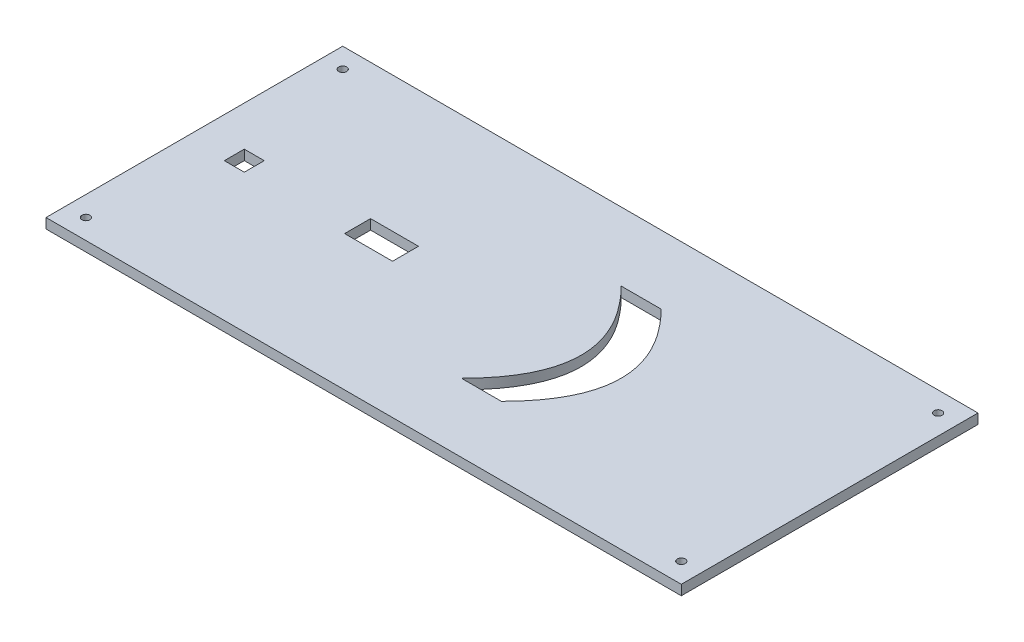
ISO-10303-21;
HEADER;
FILE_DESCRIPTION(('STEP AP214'),'2;1');
FILE_NAME('part.step','',(''),(''),'','','');
FILE_SCHEMA(('AUTOMOTIVE_DESIGN { 1 0 10303 214 1 1 1 1 }'));
ENDSEC;
DATA;
#1=APPLICATION_CONTEXT('core data for automotive mechanical design processes');
#2=APPLICATION_PROTOCOL_DEFINITION('international standard','automotive_design',2000,#1);
#3=PRODUCT_CONTEXT('',#1,'mechanical');
#4=PRODUCT('Part','Part','',(#3));
#5=PRODUCT_RELATED_PRODUCT_CATEGORY('part','',(#4));
#6=PRODUCT_DEFINITION_FORMATION('','',#4);
#7=PRODUCT_DEFINITION_CONTEXT('part definition',#1,'design');
#8=PRODUCT_DEFINITION('design','',#6,#7);
#9=PRODUCT_DEFINITION_SHAPE('','',#8);
#10=(LENGTH_UNIT() NAMED_UNIT(*) SI_UNIT(.MILLI.,.METRE.));
#11=(NAMED_UNIT(*) PLANE_ANGLE_UNIT() SI_UNIT($,.RADIAN.));
#12=(NAMED_UNIT(*) SI_UNIT($,.STERADIAN.) SOLID_ANGLE_UNIT());
#13=UNCERTAINTY_MEASURE_WITH_UNIT(LENGTH_MEASURE(1.E-05),#10,'distance_accuracy_value','');
#14=(GEOMETRIC_REPRESENTATION_CONTEXT(3) GLOBAL_UNCERTAINTY_ASSIGNED_CONTEXT((#13)) GLOBAL_UNIT_ASSIGNED_CONTEXT((#10,
#11,#12)) REPRESENTATION_CONTEXT('',''));
#15=CARTESIAN_POINT('',(0.,0.,0.));
#16=DIRECTION('',(0.,0.,1.));
#17=DIRECTION('',(1.,0.,0.));
#18=AXIS2_PLACEMENT_3D('',#15,#16,#17);
#19=CARTESIAN_POINT('',(0.,5.,0.));
#20=DIRECTION('',(0.,1.,0.));
#21=DIRECTION('',(0.,0.,1.));
#22=AXIS2_PLACEMENT_3D('',#19,#20,#21);
#23=PLANE('',#22);
#24=DIRECTION('',(1.,0.,0.));
#25=VECTOR('',#24,1.);
#26=CARTESIAN_POINT('',(0.,5.,83.6828178047649));
#27=LINE('',#26,#25);
#28=CARTESIAN_POINT('',(49.9824819781354,5.,83.6828178047649));
#29=VERTEX_POINT('',#28);
#30=CARTESIAN_POINT('',(73.9824819781354,5.,83.6828178047649));
#31=VERTEX_POINT('',#30);
#32=EDGE_CURVE('E336',#29,#31,#27,.T.);
#33=ORIENTED_EDGE('',*,*,#32,.F.);
#34=DIRECTION('',(0.,0.,1.));
#35=VECTOR('',#34,1.);
#36=CARTESIAN_POINT('',(49.9824819781354,5.,0.));
#37=LINE('',#36,#35);
#38=CARTESIAN_POINT('',(49.9824819781354,5.,70.6828178047649));
#39=VERTEX_POINT('',#38);
#40=EDGE_CURVE('E326',#39,#29,#37,.T.);
#41=ORIENTED_EDGE('',*,*,#40,.F.);
#42=DIRECTION('',(-1.,0.,0.));
#43=VECTOR('',#42,1.);
#44=CARTESIAN_POINT('',(0.,5.,70.6828178047649));
#45=LINE('',#44,#43);
#46=CARTESIAN_POINT('',(73.9824819781354,5.,70.6828178047649));
#47=VERTEX_POINT('',#46);
#48=EDGE_CURVE('E330',#47,#39,#45,.T.);
#49=ORIENTED_EDGE('',*,*,#48,.F.);
#50=DIRECTION('',(0.,0.,-1.));
#51=VECTOR('',#50,1.);
#52=CARTESIAN_POINT('',(73.9824819781354,5.,0.));
#53=LINE('',#52,#51);
#54=EDGE_CURVE('E333',#31,#47,#53,.T.);
#55=ORIENTED_EDGE('',*,*,#54,.F.);
#56=EDGE_LOOP('',(#33,#41,#49,#55));
#57=FACE_BOUND('',#56,.T.);
#58=CARTESIAN_POINT('',(276.384454851621,5.,141.477817804765));
#59=DIRECTION('',(0.,1.,0.));
#60=DIRECTION('',(0.,0.,1.));
#61=AXIS2_PLACEMENT_3D('',#58,#59,#60);
#62=CIRCLE('',#61,2.);
#63=CARTESIAN_POINT('',(276.384454851621,5.,143.477817804765));
#64=VERTEX_POINT('',#63);
#65=EDGE_CURVE('E299',#64,#64,#62,.T.);
#66=ORIENTED_EDGE('',*,*,#65,.F.);
#67=EDGE_LOOP('',(#66));
#68=FACE_BOUND('',#67,.T.);
#69=CARTESIAN_POINT('',(276.384454851621,5.,12.8878178047649));
#70=DIRECTION('',(0.,1.,0.));
#71=DIRECTION('',(0.,0.,1.));
#72=AXIS2_PLACEMENT_3D('',#69,#70,#71);
#73=CIRCLE('',#72,2.);
#74=CARTESIAN_POINT('',(276.384454851621,5.,14.8878178047649));
#75=VERTEX_POINT('',#74);
#76=EDGE_CURVE('E306',#75,#75,#73,.T.);
#77=ORIENTED_EDGE('',*,*,#76,.F.);
#78=EDGE_LOOP('',(#77));
#79=FACE_BOUND('',#78,.T.);
#80=CARTESIAN_POINT('',(-21.7655451483791,5.,12.8878178047649));
#81=DIRECTION('',(0.,1.,0.));
#82=DIRECTION('',(0.,0.,1.));
#83=AXIS2_PLACEMENT_3D('',#80,#81,#82);
#84=CIRCLE('',#83,2.);
#85=CARTESIAN_POINT('',(-21.7655451483791,5.,14.8878178047649));
#86=VERTEX_POINT('',#85);
#87=EDGE_CURVE('E312',#86,#86,#84,.T.);
#88=ORIENTED_EDGE('',*,*,#87,.F.);
#89=EDGE_LOOP('',(#88));
#90=FACE_BOUND('',#89,.T.);
#91=CARTESIAN_POINT('',(-21.7655451483791,5.,141.477817804765));
#92=DIRECTION('',(0.,1.,0.));
#93=DIRECTION('',(0.,0.,1.));
#94=AXIS2_PLACEMENT_3D('',#91,#92,#93);
#95=CIRCLE('',#94,2.);
#96=CARTESIAN_POINT('',(-21.7655451483791,5.,143.477817804765));
#97=VERTEX_POINT('',#96);
#98=EDGE_CURVE('E293',#97,#97,#95,.T.);
#99=ORIENTED_EDGE('',*,*,#98,.F.);
#100=EDGE_LOOP('',(#99));
#101=FACE_BOUND('',#100,.T.);
#102=DIRECTION('',(0.,0.,1.));
#103=VECTOR('',#102,1.);
#104=CARTESIAN_POINT('',(286.384454851621,5.,1.06989237388449E-13));
#105=LINE('',#104,#103);
#106=CARTESIAN_POINT('',(286.384454851621,5.,2.88781780476488));
#107=VERTEX_POINT('',#106);
#108=CARTESIAN_POINT('',(286.384454851621,5.,151.477817804765));
#109=VERTEX_POINT('',#108);
#110=EDGE_CURVE('E272',#107,#109,#105,.T.);
#111=ORIENTED_EDGE('',*,*,#110,.F.);
#112=DIRECTION('',(1.,0.,0.));
#113=VECTOR('',#112,1.);
#114=CARTESIAN_POINT('',(0.,5.,2.88781780476488));
#115=LINE('',#114,#113);
#116=CARTESIAN_POINT('',(-31.7655451483791,5.,2.88781780476488));
#117=VERTEX_POINT('',#116);
#118=EDGE_CURVE('E288',#117,#107,#115,.T.);
#119=ORIENTED_EDGE('',*,*,#118,.F.);
#120=DIRECTION('',(0.,0.,1.));
#121=VECTOR('',#120,1.);
#122=CARTESIAN_POINT('',(-31.7655451483791,5.,0.));
#123=LINE('',#122,#121);
#124=CARTESIAN_POINT('',(-31.7655451483791,5.,151.477817804765));
#125=VERTEX_POINT('',#124);
#126=EDGE_CURVE('E279',#117,#125,#123,.T.);
#127=ORIENTED_EDGE('',*,*,#126,.T.);
#128=DIRECTION('',(1.,0.,0.));
#129=VECTOR('',#128,1.);
#130=CARTESIAN_POINT('',(0.,5.,151.477817804765));
#131=LINE('',#130,#129);
#132=EDGE_CURVE('E276',#125,#109,#131,.T.);
#133=ORIENTED_EDGE('',*,*,#132,.T.);
#134=EDGE_LOOP('',(#111,#119,#127,#133));
#135=FACE_BOUND('',#134,.T.);
#136=DIRECTION('',(-1.,0.,0.));
#137=VECTOR('',#136,1.);
#138=CARTESIAN_POINT('',(161.982481978135,5.,37.1828178047649));
#139=LINE('',#138,#137);
#140=CARTESIAN_POINT('',(161.982481978135,5.,37.1828178047649));
#141=VERTEX_POINT('',#140);
#142=CARTESIAN_POINT('',(141.982481978135,5.,37.1828178047649));
#143=VERTEX_POINT('',#142);
#144=EDGE_CURVE('E185',#141,#143,#139,.T.);
#145=ORIENTED_EDGE('',*,*,#144,.F.);
#146=CARTESIAN_POINT('',(161.982481978135,5.,117.182817804765));
#147=CARTESIAN_POINT('',(201.982481978135,5.,77.1828178047649));
#148=CARTESIAN_POINT('',(161.982481978135,5.,37.1828178047649));
#149=B_SPLINE_CURVE_WITH_KNOTS('',2,(#146,#147,#148),.UNSPECIFIED.,.F.,.F.,(3,3),(0.,1.),.UNSPECIFIED.);
#150=CARTESIAN_POINT('',(161.982481978135,5.,117.182817804765));
#151=VERTEX_POINT('',#150);
#152=EDGE_CURVE('E180',#151,#141,#149,.T.);
#153=ORIENTED_EDGE('',*,*,#152,.F.);
#154=DIRECTION('',(-1.,0.,0.));
#155=VECTOR('',#154,1.);
#156=CARTESIAN_POINT('',(161.982481978135,5.,117.182817804765));
#157=LINE('',#156,#155);
#158=CARTESIAN_POINT('',(141.982481978135,5.,117.182817804765));
#159=VERTEX_POINT('',#158);
#160=EDGE_CURVE('E358',#151,#159,#157,.T.);
#161=ORIENTED_EDGE('',*,*,#160,.T.);
#162=CARTESIAN_POINT('',(141.982481978135,5.,117.182817804765));
#163=CARTESIAN_POINT('',(181.982481978135,5.,77.1828178047649));
#164=CARTESIAN_POINT('',(141.982481978135,5.,37.1828178047649));
#165=B_SPLINE_CURVE_WITH_KNOTS('',2,(#162,#163,#164),.UNSPECIFIED.,.F.,.F.,(3,3),(0.,1.),.UNSPECIFIED.);
#166=EDGE_CURVE('E380',#159,#143,#165,.T.);
#167=ORIENTED_EDGE('',*,*,#166,.T.);
#168=EDGE_LOOP('',(#145,#153,#161,#167));
#169=FACE_BOUND('',#168,.T.);
#170=DIRECTION('',(0.,0.,1.));
#171=VECTOR('',#170,1.);
#172=CARTESIAN_POINT('',(-11.7655451483791,5.,0.));
#173=LINE('',#172,#171);
#174=CARTESIAN_POINT('',(-11.7655451483791,5.,72.1828178047649));
#175=VERTEX_POINT('',#174);
#176=CARTESIAN_POINT('',(-11.7655451483791,5.,82.1828178047649));
#177=VERTEX_POINT('',#176);
#178=EDGE_CURVE('E151',#175,#177,#173,.T.);
#179=ORIENTED_EDGE('',*,*,#178,.F.);
#180=DIRECTION('',(-1.,0.,0.));
#181=VECTOR('',#180,1.);
#182=CARTESIAN_POINT('',(0.,5.,72.1828178047649));
#183=LINE('',#182,#181);
#184=CARTESIAN_POINT('',(-1.76554514837909,5.,72.1828178047649));
#185=VERTEX_POINT('',#184);
#186=EDGE_CURVE('E148',#185,#175,#183,.T.);
#187=ORIENTED_EDGE('',*,*,#186,.F.);
#188=DIRECTION('',(0.,0.,1.));
#189=VECTOR('',#188,1.);
#190=CARTESIAN_POINT('',(-1.76554514837909,5.,0.));
#191=LINE('',#190,#189);
#192=CARTESIAN_POINT('',(-1.76554514837909,5.,82.1828178047649));
#193=VERTEX_POINT('',#192);
#194=EDGE_CURVE('E154',#185,#193,#191,.T.);
#195=ORIENTED_EDGE('',*,*,#194,.T.);
#196=DIRECTION('',(1.,0.,0.));
#197=VECTOR('',#196,1.);
#198=CARTESIAN_POINT('',(0.,5.,82.1828178047649));
#199=LINE('',#198,#197);
#200=EDGE_CURVE('E158',#177,#193,#199,.T.);
#201=ORIENTED_EDGE('',*,*,#200,.F.);
#202=EDGE_LOOP('',(#179,#187,#195,#201));
#203=FACE_BOUND('',#202,.T.);
#204=ADVANCED_FACE('F34',(#57,#68,#79,#90,#101,#135,#169,#203),#23,.T.);
#205=CARTESIAN_POINT('',(0.,0.,0.));
#206=DIRECTION('',(0.,1.,0.));
#207=DIRECTION('',(0.,0.,1.));
#208=AXIS2_PLACEMENT_3D('',#205,#206,#207);
#209=PLANE('',#208);
#210=CARTESIAN_POINT('',(161.982481978135,0.,117.182817804765));
#211=CARTESIAN_POINT('',(201.982481978135,0.,77.1828178047649));
#212=CARTESIAN_POINT('',(161.982481978135,0.,37.1828178047649));
#213=B_SPLINE_CURVE_WITH_KNOTS('',2,(#210,#211,#212),.UNSPECIFIED.,.F.,.F.,(3,3),(0.,1.),.UNSPECIFIED.);
#214=CARTESIAN_POINT('',(161.982481978135,0.,117.182817804765));
#215=VERTEX_POINT('',#214);
#216=CARTESIAN_POINT('',(161.982481978135,0.,37.1828178047649));
#217=VERTEX_POINT('',#216);
#218=EDGE_CURVE('E176',#215,#217,#213,.T.);
#219=ORIENTED_EDGE('',*,*,#218,.T.);
#220=DIRECTION('',(-1.,0.,0.));
#221=VECTOR('',#220,1.);
#222=CARTESIAN_POINT('',(161.982481978135,0.,37.1828178047649));
#223=LINE('',#222,#221);
#224=CARTESIAN_POINT('',(141.982481978135,0.,37.1828178047649));
#225=VERTEX_POINT('',#224);
#226=EDGE_CURVE('E366',#217,#225,#223,.T.);
#227=ORIENTED_EDGE('',*,*,#226,.T.);
#228=CARTESIAN_POINT('',(141.982481978135,0.,117.182817804765));
#229=CARTESIAN_POINT('',(181.982481978135,0.,77.1828178047649));
#230=CARTESIAN_POINT('',(141.982481978135,0.,37.1828178047649));
#231=B_SPLINE_CURVE_WITH_KNOTS('',2,(#228,#229,#230),.UNSPECIFIED.,.F.,.F.,(3,3),(0.,1.),.UNSPECIFIED.);
#232=CARTESIAN_POINT('',(141.982481978135,0.,117.182817804765));
#233=VERTEX_POINT('',#232);
#234=EDGE_CURVE('E361',#233,#225,#231,.T.);
#235=ORIENTED_EDGE('',*,*,#234,.F.);
#236=DIRECTION('',(-1.,0.,0.));
#237=VECTOR('',#236,1.);
#238=CARTESIAN_POINT('',(161.982481978135,0.,117.182817804765));
#239=LINE('',#238,#237);
#240=EDGE_CURVE('E186',#215,#233,#239,.T.);
#241=ORIENTED_EDGE('',*,*,#240,.F.);
#242=EDGE_LOOP('',(#219,#227,#235,#241));
#243=FACE_BOUND('',#242,.T.);
#244=DIRECTION('',(0.,0.,1.));
#245=VECTOR('',#244,1.);
#246=CARTESIAN_POINT('',(49.9824819781354,0.,0.));
#247=LINE('',#246,#245);
#248=CARTESIAN_POINT('',(49.9824819781354,0.,70.6828178047649));
#249=VERTEX_POINT('',#248);
#250=CARTESIAN_POINT('',(49.9824819781354,0.,83.6828178047649));
#251=VERTEX_POINT('',#250);
#252=EDGE_CURVE('E321',#249,#251,#247,.T.);
#253=ORIENTED_EDGE('',*,*,#252,.T.);
#254=DIRECTION('',(1.,0.,0.));
#255=VECTOR('',#254,1.);
#256=CARTESIAN_POINT('',(0.,0.,83.6828178047649));
#257=LINE('',#256,#255);
#258=CARTESIAN_POINT('',(73.9824819781354,0.,83.6828178047649));
#259=VERTEX_POINT('',#258);
#260=EDGE_CURVE('E329',#251,#259,#257,.T.);
#261=ORIENTED_EDGE('',*,*,#260,.T.);
#262=DIRECTION('',(0.,0.,-1.));
#263=VECTOR('',#262,1.);
#264=CARTESIAN_POINT('',(73.9824819781354,0.,0.));
#265=LINE('',#264,#263);
#266=CARTESIAN_POINT('',(73.9824819781354,0.,70.6828178047649));
#267=VERTEX_POINT('',#266);
#268=EDGE_CURVE('E344',#259,#267,#265,.T.);
#269=ORIENTED_EDGE('',*,*,#268,.T.);
#270=DIRECTION('',(-1.,0.,0.));
#271=VECTOR('',#270,1.);
#272=CARTESIAN_POINT('',(0.,0.,70.6828178047649));
#273=LINE('',#272,#271);
#274=EDGE_CURVE('E341',#267,#249,#273,.T.);
#275=ORIENTED_EDGE('',*,*,#274,.T.);
#276=EDGE_LOOP('',(#253,#261,#269,#275));
#277=FACE_BOUND('',#276,.T.);
#278=CARTESIAN_POINT('',(276.384454851621,0.,141.477817804765));
#279=DIRECTION('',(0.,1.,0.));
#280=DIRECTION('',(0.,0.,1.));
#281=AXIS2_PLACEMENT_3D('',#278,#279,#280);
#282=CIRCLE('',#281,2.);
#283=CARTESIAN_POINT('',(276.384454851621,0.,143.477817804765));
#284=VERTEX_POINT('',#283);
#285=EDGE_CURVE('E302',#284,#284,#282,.T.);
#286=ORIENTED_EDGE('',*,*,#285,.T.);
#287=EDGE_LOOP('',(#286));
#288=FACE_BOUND('',#287,.T.);
#289=CARTESIAN_POINT('',(276.384454851621,0.,12.8878178047649));
#290=DIRECTION('',(0.,1.,0.));
#291=DIRECTION('',(0.,0.,1.));
#292=AXIS2_PLACEMENT_3D('',#289,#290,#291);
#293=CIRCLE('',#292,2.);
#294=CARTESIAN_POINT('',(276.384454851621,0.,14.8878178047649));
#295=VERTEX_POINT('',#294);
#296=EDGE_CURVE('E309',#295,#295,#293,.T.);
#297=ORIENTED_EDGE('',*,*,#296,.T.);
#298=EDGE_LOOP('',(#297));
#299=FACE_BOUND('',#298,.T.);
#300=CARTESIAN_POINT('',(-21.7655451483791,0.,12.8878178047649));
#301=DIRECTION('',(0.,1.,0.));
#302=DIRECTION('',(0.,0.,1.));
#303=AXIS2_PLACEMENT_3D('',#300,#301,#302);
#304=CIRCLE('',#303,2.);
#305=CARTESIAN_POINT('',(-21.7655451483791,0.,14.8878178047649));
#306=VERTEX_POINT('',#305);
#307=EDGE_CURVE('E296',#306,#306,#304,.T.);
#308=ORIENTED_EDGE('',*,*,#307,.T.);
#309=EDGE_LOOP('',(#308));
#310=FACE_BOUND('',#309,.T.);
#311=CARTESIAN_POINT('',(-21.7655451483791,0.,141.477817804765));
#312=DIRECTION('',(0.,1.,0.));
#313=DIRECTION('',(0.,0.,1.));
#314=AXIS2_PLACEMENT_3D('',#311,#312,#313);
#315=CIRCLE('',#314,2.);
#316=CARTESIAN_POINT('',(-21.7655451483791,0.,143.477817804765));
#317=VERTEX_POINT('',#316);
#318=EDGE_CURVE('E266',#317,#317,#315,.T.);
#319=ORIENTED_EDGE('',*,*,#318,.T.);
#320=EDGE_LOOP('',(#319));
#321=FACE_BOUND('',#320,.T.);
#322=DIRECTION('',(0.,0.,1.));
#323=VECTOR('',#322,1.);
#324=CARTESIAN_POINT('',(286.384454851621,0.,1.06989237388449E-13));
#325=LINE('',#324,#323);
#326=CARTESIAN_POINT('',(286.384454851621,0.,2.88781780476488));
#327=VERTEX_POINT('',#326);
#328=CARTESIAN_POINT('',(286.384454851621,0.,151.477817804765));
#329=VERTEX_POINT('',#328);
#330=EDGE_CURVE('E262',#327,#329,#325,.T.);
#331=ORIENTED_EDGE('',*,*,#330,.T.);
#332=DIRECTION('',(1.,0.,0.));
#333=VECTOR('',#332,1.);
#334=CARTESIAN_POINT('',(0.,0.,151.477817804765));
#335=LINE('',#334,#333);
#336=CARTESIAN_POINT('',(-31.7655451483791,0.,151.477817804765));
#337=VERTEX_POINT('',#336);
#338=EDGE_CURVE('E264',#337,#329,#335,.T.);
#339=ORIENTED_EDGE('',*,*,#338,.F.);
#340=DIRECTION('',(0.,0.,1.));
#341=VECTOR('',#340,1.);
#342=CARTESIAN_POINT('',(-31.7655451483791,0.,0.));
#343=LINE('',#342,#341);
#344=CARTESIAN_POINT('',(-31.7655451483791,0.,2.88781780476488));
#345=VERTEX_POINT('',#344);
#346=EDGE_CURVE('E261',#345,#337,#343,.T.);
#347=ORIENTED_EDGE('',*,*,#346,.F.);
#348=DIRECTION('',(1.,0.,0.));
#349=VECTOR('',#348,1.);
#350=CARTESIAN_POINT('',(0.,0.,2.88781780476488));
#351=LINE('',#350,#349);
#352=EDGE_CURVE('E254',#345,#327,#351,.T.);
#353=ORIENTED_EDGE('',*,*,#352,.T.);
#354=EDGE_LOOP('',(#331,#339,#347,#353));
#355=FACE_BOUND('',#354,.T.);
#356=DIRECTION('',(-1.,0.,0.));
#357=VECTOR('',#356,1.);
#358=CARTESIAN_POINT('',(0.,0.,72.1828178047649));
#359=LINE('',#358,#357);
#360=CARTESIAN_POINT('',(-1.76554514837909,0.,72.1828178047649));
#361=VERTEX_POINT('',#360);
#362=CARTESIAN_POINT('',(-11.7655451483791,0.,72.1828178047649));
#363=VERTEX_POINT('',#362);
#364=EDGE_CURVE('E57',#361,#363,#359,.T.);
#365=ORIENTED_EDGE('',*,*,#364,.T.);
#366=DIRECTION('',(0.,0.,1.));
#367=VECTOR('',#366,1.);
#368=CARTESIAN_POINT('',(-11.7655451483791,0.,0.));
#369=LINE('',#368,#367);
#370=CARTESIAN_POINT('',(-11.7655451483791,0.,82.1828178047649));
#371=VERTEX_POINT('',#370);
#372=EDGE_CURVE('E161',#363,#371,#369,.T.);
#373=ORIENTED_EDGE('',*,*,#372,.T.);
#374=DIRECTION('',(1.,0.,0.));
#375=VECTOR('',#374,1.);
#376=CARTESIAN_POINT('',(0.,0.,82.1828178047649));
#377=LINE('',#376,#375);
#378=CARTESIAN_POINT('',(-1.76554514837909,0.,82.1828178047649));
#379=VERTEX_POINT('',#378);
#380=EDGE_CURVE('E164',#371,#379,#377,.T.);
#381=ORIENTED_EDGE('',*,*,#380,.T.);
#382=DIRECTION('',(0.,0.,1.));
#383=VECTOR('',#382,1.);
#384=CARTESIAN_POINT('',(-1.76554514837909,0.,0.));
#385=LINE('',#384,#383);
#386=EDGE_CURVE('E170',#361,#379,#385,.T.);
#387=ORIENTED_EDGE('',*,*,#386,.F.);
#388=EDGE_LOOP('',(#365,#373,#381,#387));
#389=FACE_BOUND('',#388,.T.);
#390=ADVANCED_FACE('F234',(#243,#277,#288,#299,#310,#321,#355,#389),#209,.F.);
#391=CARTESIAN_POINT('',(286.384454851621,5.,1.06989237388449E-13));
#392=DIRECTION('',(1.,0.,0.));
#393=DIRECTION('',(0.,0.,-1.));
#394=AXIS2_PLACEMENT_3D('',#391,#392,#393);
#395=PLANE('',#394);
#396=ORIENTED_EDGE('',*,*,#330,.F.);
#397=DIRECTION('',(0.,-1.,0.));
#398=VECTOR('',#397,1.);
#399=CARTESIAN_POINT('',(286.384454851621,5.,2.88781780476488));
#400=LINE('',#399,#398);
#401=EDGE_CURVE('E11',#107,#327,#400,.T.);
#402=ORIENTED_EDGE('',*,*,#401,.F.);
#403=ORIENTED_EDGE('',*,*,#110,.T.);
#404=DIRECTION('',(0.,-1.,0.));
#405=VECTOR('',#404,1.);
#406=CARTESIAN_POINT('',(286.384454851621,5.,151.477817804765));
#407=LINE('',#406,#405);
#408=EDGE_CURVE('E273',#109,#329,#407,.T.);
#409=ORIENTED_EDGE('',*,*,#408,.T.);
#410=EDGE_LOOP('',(#396,#402,#403,#409));
#411=FACE_BOUND('',#410,.T.);
#412=ADVANCED_FACE('F36',(#411),#395,.T.);
#413=CARTESIAN_POINT('',(0.,5.,2.88781780476488));
#414=DIRECTION('',(0.,0.,-1.));
#415=DIRECTION('',(-1.,0.,0.));
#416=AXIS2_PLACEMENT_3D('',#413,#414,#415);
#417=PLANE('',#416);
#418=ORIENTED_EDGE('',*,*,#352,.F.);
#419=DIRECTION('',(0.,-1.,0.));
#420=VECTOR('',#419,1.);
#421=CARTESIAN_POINT('',(-31.7655451483791,5.,2.88781780476488));
#422=LINE('',#421,#420);
#423=EDGE_CURVE('E42',#117,#345,#422,.T.);
#424=ORIENTED_EDGE('',*,*,#423,.F.);
#425=ORIENTED_EDGE('',*,*,#118,.T.);
#426=ORIENTED_EDGE('',*,*,#401,.T.);
#427=EDGE_LOOP('',(#418,#424,#425,#426));
#428=FACE_BOUND('',#427,.T.);
#429=ADVANCED_FACE('F244',(#428),#417,.T.);
#430=CARTESIAN_POINT('',(-31.7655451483791,5.,0.));
#431=DIRECTION('',(1.,0.,0.));
#432=DIRECTION('',(0.,0.,-1.));
#433=AXIS2_PLACEMENT_3D('',#430,#431,#432);
#434=PLANE('',#433);
#435=ORIENTED_EDGE('',*,*,#346,.T.);
#436=DIRECTION('',(0.,-1.,0.));
#437=VECTOR('',#436,1.);
#438=CARTESIAN_POINT('',(-31.7655451483791,5.,151.477817804765));
#439=LINE('',#438,#437);
#440=EDGE_CURVE('E275',#125,#337,#439,.T.);
#441=ORIENTED_EDGE('',*,*,#440,.F.);
#442=ORIENTED_EDGE('',*,*,#126,.F.);
#443=ORIENTED_EDGE('',*,*,#423,.T.);
#444=EDGE_LOOP('',(#435,#441,#442,#443));
#445=FACE_BOUND('',#444,.T.);
#446=ADVANCED_FACE('F241',(#445),#434,.F.);
#447=CARTESIAN_POINT('',(0.,5.,151.477817804765));
#448=DIRECTION('',(0.,0.,-1.));
#449=DIRECTION('',(-1.,0.,0.));
#450=AXIS2_PLACEMENT_3D('',#447,#448,#449);
#451=PLANE('',#450);
#452=ORIENTED_EDGE('',*,*,#338,.T.);
#453=ORIENTED_EDGE('',*,*,#408,.F.);
#454=ORIENTED_EDGE('',*,*,#132,.F.);
#455=ORIENTED_EDGE('',*,*,#440,.T.);
#456=EDGE_LOOP('',(#452,#453,#454,#455));
#457=FACE_BOUND('',#456,.T.);
#458=ADVANCED_FACE('F230',(#457),#451,.F.);
#459=CARTESIAN_POINT('',(-21.7655451483791,0.,141.477817804765));
#460=DIRECTION('',(0.,1.,0.));
#461=DIRECTION('',(0.,0.,1.));
#462=AXIS2_PLACEMENT_3D('',#459,#460,#461);
#463=CYLINDRICAL_SURFACE('',#462,2.);
#464=ORIENTED_EDGE('',*,*,#318,.F.);
#465=EDGE_LOOP('',(#464));
#466=FACE_BOUND('',#465,.T.);
#467=ORIENTED_EDGE('',*,*,#98,.T.);
#468=EDGE_LOOP('',(#467));
#469=FACE_BOUND('',#468,.T.);
#470=ADVANCED_FACE('F220',(#466,#469),#463,.F.);
#471=CARTESIAN_POINT('',(-21.7655451483791,0.,12.8878178047649));
#472=DIRECTION('',(0.,1.,0.));
#473=DIRECTION('',(0.,0.,1.));
#474=AXIS2_PLACEMENT_3D('',#471,#472,#473);
#475=CYLINDRICAL_SURFACE('',#474,2.);
#476=ORIENTED_EDGE('',*,*,#307,.F.);
#477=EDGE_LOOP('',(#476));
#478=FACE_BOUND('',#477,.T.);
#479=ORIENTED_EDGE('',*,*,#87,.T.);
#480=EDGE_LOOP('',(#479));
#481=FACE_BOUND('',#480,.T.);
#482=ADVANCED_FACE('F216',(#478,#481),#475,.F.);
#483=CARTESIAN_POINT('',(276.384454851621,0.,12.8878178047649));
#484=DIRECTION('',(0.,1.,0.));
#485=DIRECTION('',(0.,0.,1.));
#486=AXIS2_PLACEMENT_3D('',#483,#484,#485);
#487=CYLINDRICAL_SURFACE('',#486,2.);
#488=ORIENTED_EDGE('',*,*,#296,.F.);
#489=EDGE_LOOP('',(#488));
#490=FACE_BOUND('',#489,.T.);
#491=ORIENTED_EDGE('',*,*,#76,.T.);
#492=EDGE_LOOP('',(#491));
#493=FACE_BOUND('',#492,.T.);
#494=ADVANCED_FACE('F219',(#490,#493),#487,.F.);
#495=CARTESIAN_POINT('',(276.384454851621,0.,141.477817804765));
#496=DIRECTION('',(0.,1.,0.));
#497=DIRECTION('',(0.,0.,1.));
#498=AXIS2_PLACEMENT_3D('',#495,#496,#497);
#499=CYLINDRICAL_SURFACE('',#498,2.);
#500=ORIENTED_EDGE('',*,*,#285,.F.);
#501=EDGE_LOOP('',(#500));
#502=FACE_BOUND('',#501,.T.);
#503=ORIENTED_EDGE('',*,*,#65,.T.);
#504=EDGE_LOOP('',(#503));
#505=FACE_BOUND('',#504,.T.);
#506=ADVANCED_FACE('F214',(#502,#505),#499,.F.);
#507=CARTESIAN_POINT('',(0.,0.,83.6828178047649));
#508=DIRECTION('',(0.,0.,1.));
#509=DIRECTION('',(1.,0.,0.));
#510=AXIS2_PLACEMENT_3D('',#507,#508,#509);
#511=PLANE('',#510);
#512=ORIENTED_EDGE('',*,*,#32,.T.);
#513=DIRECTION('',(0.,1.,0.));
#514=VECTOR('',#513,1.);
#515=CARTESIAN_POINT('',(73.9824819781354,0.,83.6828178047649));
#516=LINE('',#515,#514);
#517=EDGE_CURVE('E317',#259,#31,#516,.T.);
#518=ORIENTED_EDGE('',*,*,#517,.F.);
#519=ORIENTED_EDGE('',*,*,#260,.F.);
#520=DIRECTION('',(0.,1.,0.));
#521=VECTOR('',#520,1.);
#522=CARTESIAN_POINT('',(49.9824819781354,0.,83.6828178047649));
#523=LINE('',#522,#521);
#524=EDGE_CURVE('E303',#251,#29,#523,.T.);
#525=ORIENTED_EDGE('',*,*,#524,.T.);
#526=EDGE_LOOP('',(#512,#518,#519,#525));
#527=FACE_BOUND('',#526,.T.);
#528=ADVANCED_FACE('F204',(#527),#511,.F.);
#529=CARTESIAN_POINT('',(49.9824819781354,0.,0.));
#530=DIRECTION('',(-1.,0.,0.));
#531=DIRECTION('',(0.,0.,1.));
#532=AXIS2_PLACEMENT_3D('',#529,#530,#531);
#533=PLANE('',#532);
#534=ORIENTED_EDGE('',*,*,#40,.T.);
#535=ORIENTED_EDGE('',*,*,#524,.F.);
#536=ORIENTED_EDGE('',*,*,#252,.F.);
#537=DIRECTION('',(0.,1.,0.));
#538=VECTOR('',#537,1.);
#539=CARTESIAN_POINT('',(49.9824819781354,0.,70.6828178047649));
#540=LINE('',#539,#538);
#541=EDGE_CURVE('E323',#249,#39,#540,.T.);
#542=ORIENTED_EDGE('',*,*,#541,.T.);
#543=EDGE_LOOP('',(#534,#535,#536,#542));
#544=FACE_BOUND('',#543,.T.);
#545=ADVANCED_FACE('F200',(#544),#533,.F.);
#546=CARTESIAN_POINT('',(0.,0.,70.6828178047649));
#547=DIRECTION('',(0.,0.,-1.));
#548=DIRECTION('',(-1.,0.,0.));
#549=AXIS2_PLACEMENT_3D('',#546,#547,#548);
#550=PLANE('',#549);
#551=ORIENTED_EDGE('',*,*,#48,.T.);
#552=ORIENTED_EDGE('',*,*,#541,.F.);
#553=ORIENTED_EDGE('',*,*,#274,.F.);
#554=DIRECTION('',(0.,1.,0.));
#555=VECTOR('',#554,1.);
#556=CARTESIAN_POINT('',(73.9824819781354,0.,70.6828178047649));
#557=LINE('',#556,#555);
#558=EDGE_CURVE('E320',#267,#47,#557,.T.);
#559=ORIENTED_EDGE('',*,*,#558,.T.);
#560=EDGE_LOOP('',(#551,#552,#553,#559));
#561=FACE_BOUND('',#560,.T.);
#562=ADVANCED_FACE('F203',(#561),#550,.F.);
#563=CARTESIAN_POINT('',(73.9824819781354,0.,0.));
#564=DIRECTION('',(1.,0.,0.));
#565=DIRECTION('',(0.,0.,-1.));
#566=AXIS2_PLACEMENT_3D('',#563,#564,#565);
#567=PLANE('',#566);
#568=ORIENTED_EDGE('',*,*,#54,.T.);
#569=ORIENTED_EDGE('',*,*,#558,.F.);
#570=ORIENTED_EDGE('',*,*,#268,.F.);
#571=ORIENTED_EDGE('',*,*,#517,.T.);
#572=EDGE_LOOP('',(#568,#569,#570,#571));
#573=FACE_BOUND('',#572,.T.);
#574=ADVANCED_FACE('F197',(#573),#567,.F.);
#575=DIRECTION('',(0.,-1.,0.));
#576=VECTOR('',#575,1.);
#577=SURFACE_OF_LINEAR_EXTRUSION('',#149,#576);
#578=ORIENTED_EDGE('',*,*,#218,.F.);
#579=DIRECTION('',(0.,-1.,0.));
#580=VECTOR('',#579,1.);
#581=CARTESIAN_POINT('',(161.982481978135,5.,117.182817804765));
#582=LINE('',#581,#580);
#583=EDGE_CURVE('E355',#151,#215,#582,.T.);
#584=ORIENTED_EDGE('',*,*,#583,.F.);
#585=ORIENTED_EDGE('',*,*,#152,.T.);
#586=DIRECTION('',(0.,-1.,0.));
#587=VECTOR('',#586,1.);
#588=CARTESIAN_POINT('',(161.982481978135,5.,37.1828178047649));
#589=LINE('',#588,#587);
#590=EDGE_CURVE('E338',#141,#217,#589,.T.);
#591=ORIENTED_EDGE('',*,*,#590,.T.);
#592=EDGE_LOOP('',(#578,#584,#585,#591));
#593=FACE_BOUND('',#592,.T.);
#594=ADVANCED_FACE('F192',(#593),#577,.T.);
#595=CARTESIAN_POINT('',(161.982481978135,5.,37.1828178047649));
#596=DIRECTION('',(0.,0.,1.));
#597=DIRECTION('',(1.,0.,0.));
#598=AXIS2_PLACEMENT_3D('',#595,#596,#597);
#599=PLANE('',#598);
#600=ORIENTED_EDGE('',*,*,#226,.F.);
#601=ORIENTED_EDGE('',*,*,#590,.F.);
#602=ORIENTED_EDGE('',*,*,#144,.T.);
#603=DIRECTION('',(0.,-1.,0.));
#604=VECTOR('',#603,1.);
#605=CARTESIAN_POINT('',(141.982481978135,5.,37.1828178047649));
#606=LINE('',#605,#604);
#607=EDGE_CURVE('E351',#143,#225,#606,.T.);
#608=ORIENTED_EDGE('',*,*,#607,.T.);
#609=EDGE_LOOP('',(#600,#601,#602,#608));
#610=FACE_BOUND('',#609,.T.);
#611=ADVANCED_FACE('F196',(#610),#599,.T.);
#612=DIRECTION('',(0.,-1.,0.));
#613=VECTOR('',#612,1.);
#614=SURFACE_OF_LINEAR_EXTRUSION('',#165,#613);
#615=ORIENTED_EDGE('',*,*,#234,.T.);
#616=ORIENTED_EDGE('',*,*,#607,.F.);
#617=ORIENTED_EDGE('',*,*,#166,.F.);
#618=DIRECTION('',(0.,-1.,0.));
#619=VECTOR('',#618,1.);
#620=CARTESIAN_POINT('',(141.982481978135,5.,117.182817804765));
#621=LINE('',#620,#619);
#622=EDGE_CURVE('E353',#159,#233,#621,.T.);
#623=ORIENTED_EDGE('',*,*,#622,.T.);
#624=EDGE_LOOP('',(#615,#616,#617,#623));
#625=FACE_BOUND('',#624,.T.);
#626=ADVANCED_FACE('F388',(#625),#614,.F.);
#627=CARTESIAN_POINT('',(161.982481978135,5.,117.182817804765));
#628=DIRECTION('',(0.,0.,1.));
#629=DIRECTION('',(1.,0.,0.));
#630=AXIS2_PLACEMENT_3D('',#627,#628,#629);
#631=PLANE('',#630);
#632=ORIENTED_EDGE('',*,*,#240,.T.);
#633=ORIENTED_EDGE('',*,*,#622,.F.);
#634=ORIENTED_EDGE('',*,*,#160,.F.);
#635=ORIENTED_EDGE('',*,*,#583,.T.);
#636=EDGE_LOOP('',(#632,#633,#634,#635));
#637=FACE_BOUND('',#636,.T.);
#638=ADVANCED_FACE('F391',(#637),#631,.F.);
#639=CARTESIAN_POINT('',(0.,5.,72.1828178047649));
#640=DIRECTION('',(0.,0.,1.));
#641=DIRECTION('',(1.,0.,0.));
#642=AXIS2_PLACEMENT_3D('',#639,#640,#641);
#643=PLANE('',#642);
#644=ORIENTED_EDGE('',*,*,#364,.F.);
#645=DIRECTION('',(0.,-1.,0.));
#646=VECTOR('',#645,1.);
#647=CARTESIAN_POINT('',(-1.76554514837909,5.,72.1828178047649));
#648=LINE('',#647,#646);
#649=EDGE_CURVE('E145',#185,#361,#648,.T.);
#650=ORIENTED_EDGE('',*,*,#649,.F.);
#651=ORIENTED_EDGE('',*,*,#186,.T.);
#652=DIRECTION('',(0.,-1.,0.));
#653=VECTOR('',#652,1.);
#654=CARTESIAN_POINT('',(-11.7655451483791,5.,72.1828178047649));
#655=LINE('',#654,#653);
#656=EDGE_CURVE('E174',#175,#363,#655,.T.);
#657=ORIENTED_EDGE('',*,*,#656,.T.);
#658=EDGE_LOOP('',(#644,#650,#651,#657));
#659=FACE_BOUND('',#658,.T.);
#660=ADVANCED_FACE('F146',(#659),#643,.T.);
#661=CARTESIAN_POINT('',(-11.7655451483791,5.,0.));
#662=DIRECTION('',(1.,0.,0.));
#663=DIRECTION('',(0.,0.,-1.));
#664=AXIS2_PLACEMENT_3D('',#661,#662,#663);
#665=PLANE('',#664);
#666=ORIENTED_EDGE('',*,*,#372,.F.);
#667=ORIENTED_EDGE('',*,*,#656,.F.);
#668=ORIENTED_EDGE('',*,*,#178,.T.);
#669=DIRECTION('',(0.,-1.,0.));
#670=VECTOR('',#669,1.);
#671=CARTESIAN_POINT('',(-11.7655451483791,5.,82.1828178047649));
#672=LINE('',#671,#670);
#673=EDGE_CURVE('E177',#177,#371,#672,.T.);
#674=ORIENTED_EDGE('',*,*,#673,.T.);
#675=EDGE_LOOP('',(#666,#667,#668,#674));
#676=FACE_BOUND('',#675,.T.);
#677=ADVANCED_FACE('F398',(#676),#665,.T.);
#678=CARTESIAN_POINT('',(0.,5.,82.1828178047649));
#679=DIRECTION('',(0.,0.,-1.));
#680=DIRECTION('',(-1.,0.,0.));
#681=AXIS2_PLACEMENT_3D('',#678,#679,#680);
#682=PLANE('',#681);
#683=ORIENTED_EDGE('',*,*,#380,.F.);
#684=ORIENTED_EDGE('',*,*,#673,.F.);
#685=ORIENTED_EDGE('',*,*,#200,.T.);
#686=DIRECTION('',(0.,-1.,0.));
#687=VECTOR('',#686,1.);
#688=CARTESIAN_POINT('',(-1.76554514837909,5.,82.1828178047649));
#689=LINE('',#688,#687);
#690=EDGE_CURVE('E49',#193,#379,#689,.T.);
#691=ORIENTED_EDGE('',*,*,#690,.T.);
#692=EDGE_LOOP('',(#683,#684,#685,#691));
#693=FACE_BOUND('',#692,.T.);
#694=ADVANCED_FACE('F401',(#693),#682,.T.);
#695=CARTESIAN_POINT('',(-1.76554514837909,5.,0.));
#696=DIRECTION('',(1.,0.,0.));
#697=DIRECTION('',(0.,0.,-1.));
#698=AXIS2_PLACEMENT_3D('',#695,#696,#697);
#699=PLANE('',#698);
#700=ORIENTED_EDGE('',*,*,#386,.T.);
#701=ORIENTED_EDGE('',*,*,#690,.F.);
#702=ORIENTED_EDGE('',*,*,#194,.F.);
#703=ORIENTED_EDGE('',*,*,#649,.T.);
#704=EDGE_LOOP('',(#700,#701,#702,#703));
#705=FACE_BOUND('',#704,.T.);
#706=ADVANCED_FACE('F155',(#705),#699,.F.);
#707=CLOSED_SHELL('',(#204,#390,#412,#429,#446,#458,#470,#482,#494,#506,#528,#545,#562,#574,
#594,#611,#626,#638,#660,#677,#694,#706));
#708=MANIFOLD_SOLID_BREP('B2',#707);
#709=ADVANCED_BREP_SHAPE_REPRESENTATION('',(#18,#708),#14);
#710=SHAPE_DEFINITION_REPRESENTATION(#9,#709);
ENDSEC;
END-ISO-10303-21;
